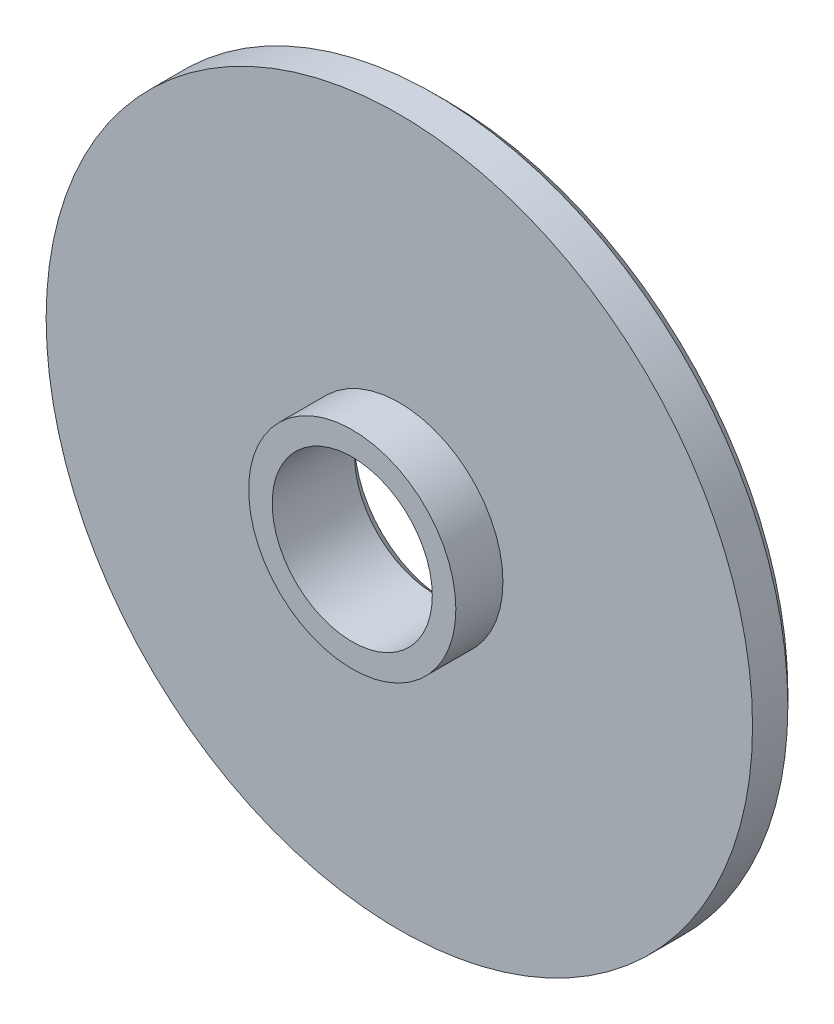
ISO-10303-21;
HEADER;
FILE_DESCRIPTION(('STEP AP214'),'2;1');
FILE_NAME('part.step','',(''),(''),'','','');
FILE_SCHEMA(('AUTOMOTIVE_DESIGN { 1 0 10303 214 1 1 1 1 }'));
ENDSEC;
DATA;
#1=APPLICATION_CONTEXT('core data for automotive mechanical design processes');
#2=APPLICATION_PROTOCOL_DEFINITION('international standard','automotive_design',2000,#1);
#3=PRODUCT_CONTEXT('',#1,'mechanical');
#4=PRODUCT('Part','Part','',(#3));
#5=PRODUCT_RELATED_PRODUCT_CATEGORY('part','',(#4));
#6=PRODUCT_DEFINITION_FORMATION('','',#4);
#7=PRODUCT_DEFINITION_CONTEXT('part definition',#1,'design');
#8=PRODUCT_DEFINITION('design','',#6,#7);
#9=PRODUCT_DEFINITION_SHAPE('','',#8);
#10=(LENGTH_UNIT() NAMED_UNIT(*) SI_UNIT(.MILLI.,.METRE.));
#11=(NAMED_UNIT(*) PLANE_ANGLE_UNIT() SI_UNIT($,.RADIAN.));
#12=(NAMED_UNIT(*) SI_UNIT($,.STERADIAN.) SOLID_ANGLE_UNIT());
#13=UNCERTAINTY_MEASURE_WITH_UNIT(LENGTH_MEASURE(1.E-05),#10,'distance_accuracy_value','');
#14=(GEOMETRIC_REPRESENTATION_CONTEXT(3) GLOBAL_UNCERTAINTY_ASSIGNED_CONTEXT((#13)) GLOBAL_UNIT_ASSIGNED_CONTEXT((#10,
#11,#12)) REPRESENTATION_CONTEXT('',''));
#15=CARTESIAN_POINT('',(0.,0.,0.));
#16=DIRECTION('',(0.,0.,1.));
#17=DIRECTION('',(1.,0.,0.));
#18=AXIS2_PLACEMENT_3D('',#15,#16,#17);
#19=CARTESIAN_POINT('',(0.,0.,1.));
#20=DIRECTION('',(0.,0.,1.));
#21=DIRECTION('',(1.,0.,0.));
#22=AXIS2_PLACEMENT_3D('',#19,#20,#21);
#23=PLANE('',#22);
#24=CARTESIAN_POINT('',(0.,0.,1.));
#25=DIRECTION('',(0.,0.,1.));
#26=DIRECTION('',(1.,0.,0.));
#27=AXIS2_PLACEMENT_3D('',#24,#25,#26);
#28=CIRCLE('',#27,7.5);
#29=CARTESIAN_POINT('',(7.5,0.,1.));
#30=VERTEX_POINT('',#29);
#31=EDGE_CURVE('E64',#30,#30,#28,.T.);
#32=ORIENTED_EDGE('',*,*,#31,.T.);
#33=EDGE_LOOP('',(#32));
#34=FACE_BOUND('',#33,.T.);
#35=CARTESIAN_POINT('',(0.,0.,1.));
#36=DIRECTION('',(0.,0.,1.));
#37=DIRECTION('',(1.,0.,0.));
#38=AXIS2_PLACEMENT_3D('',#35,#36,#37);
#39=CIRCLE('',#38,2.2);
#40=CARTESIAN_POINT('',(2.2,0.,1.));
#41=VERTEX_POINT('',#40);
#42=EDGE_CURVE('E69',#41,#41,#39,.T.);
#43=ORIENTED_EDGE('',*,*,#42,.F.);
#44=EDGE_LOOP('',(#43));
#45=FACE_BOUND('',#44,.T.);
#46=ADVANCED_FACE('F39',(#34,#45),#23,.T.);
#47=CARTESIAN_POINT('',(0.,0.,0.));
#48=DIRECTION('',(0.,0.,1.));
#49=DIRECTION('',(1.,0.,0.));
#50=AXIS2_PLACEMENT_3D('',#47,#48,#49);
#51=PLANE('',#50);
#52=CARTESIAN_POINT('',(0.,0.,0.));
#53=DIRECTION('',(0.,0.,1.));
#54=DIRECTION('',(1.,0.,0.));
#55=AXIS2_PLACEMENT_3D('',#52,#53,#54);
#56=CIRCLE('',#55,1.95);
#57=CARTESIAN_POINT('',(1.95,0.,0.));
#58=VERTEX_POINT('',#57);
#59=EDGE_CURVE('E53',#58,#58,#56,.T.);
#60=ORIENTED_EDGE('',*,*,#59,.T.);
#61=EDGE_LOOP('',(#60));
#62=FACE_BOUND('',#61,.T.);
#63=CARTESIAN_POINT('',(0.,0.,0.));
#64=DIRECTION('',(0.,0.,1.));
#65=DIRECTION('',(1.,0.,0.));
#66=AXIS2_PLACEMENT_3D('',#63,#64,#65);
#67=CIRCLE('',#66,7.25);
#68=CARTESIAN_POINT('',(7.25,0.,0.));
#69=VERTEX_POINT('',#68);
#70=EDGE_CURVE('E58',#69,#69,#67,.F.);
#71=ORIENTED_EDGE('',*,*,#70,.T.);
#72=EDGE_LOOP('',(#71));
#73=FACE_BOUND('',#72,.T.);
#74=ADVANCED_FACE('F98',(#62,#73),#51,.F.);
#75=CARTESIAN_POINT('',(0.,0.,1.));
#76=DIRECTION('',(0.,0.,-1.));
#77=DIRECTION('',(-1.,0.,0.));
#78=AXIS2_PLACEMENT_3D('',#75,#76,#77);
#79=CYLINDRICAL_SURFACE('',#78,7.5);
#80=CARTESIAN_POINT('',(0.,0.,0.250000000000001));
#81=DIRECTION('',(0.,0.,1.));
#82=DIRECTION('',(1.,0.,0.));
#83=AXIS2_PLACEMENT_3D('',#80,#81,#82);
#84=CIRCLE('',#83,7.5);
#85=CARTESIAN_POINT('',(7.5,0.,0.250000000000001));
#86=VERTEX_POINT('',#85);
#87=EDGE_CURVE('E10',#86,#86,#84,.T.);
#88=ORIENTED_EDGE('',*,*,#87,.T.);
#89=EDGE_LOOP('',(#88));
#90=FACE_BOUND('',#89,.T.);
#91=ORIENTED_EDGE('',*,*,#31,.F.);
#92=EDGE_LOOP('',(#91));
#93=FACE_BOUND('',#92,.T.);
#94=ADVANCED_FACE('F95',(#90,#93),#79,.T.);
#95=CARTESIAN_POINT('',(0.,0.,1.));
#96=DIRECTION('',(0.,0.,-1.));
#97=DIRECTION('',(-1.,0.,0.));
#98=AXIS2_PLACEMENT_3D('',#95,#96,#97);
#99=CYLINDRICAL_SURFACE('',#98,1.7);
#100=CARTESIAN_POINT('',(0.,0.,0.250000000000001));
#101=DIRECTION('',(0.,0.,1.));
#102=DIRECTION('',(1.,0.,0.));
#103=AXIS2_PLACEMENT_3D('',#100,#101,#102);
#104=CIRCLE('',#103,1.7);
#105=CARTESIAN_POINT('',(1.7,0.,0.250000000000001));
#106=VERTEX_POINT('',#105);
#107=EDGE_CURVE('E48',#106,#106,#104,.F.);
#108=ORIENTED_EDGE('',*,*,#107,.T.);
#109=EDGE_LOOP('',(#108));
#110=FACE_BOUND('',#109,.T.);
#111=CARTESIAN_POINT('',(0.,0.,2.));
#112=DIRECTION('',(0.,0.,1.));
#113=DIRECTION('',(1.,0.,0.));
#114=AXIS2_PLACEMENT_3D('',#111,#112,#113);
#115=CIRCLE('',#114,1.7);
#116=CARTESIAN_POINT('',(1.7,0.,2.));
#117=VERTEX_POINT('',#116);
#118=EDGE_CURVE('E73',#117,#117,#115,.T.);
#119=ORIENTED_EDGE('',*,*,#118,.T.);
#120=EDGE_LOOP('',(#119));
#121=FACE_BOUND('',#120,.T.);
#122=ADVANCED_FACE('F81',(#110,#121),#99,.F.);
#123=CARTESIAN_POINT('',(0.,0.,2.));
#124=DIRECTION('',(0.,0.,1.));
#125=DIRECTION('',(1.,0.,0.));
#126=AXIS2_PLACEMENT_3D('',#123,#124,#125);
#127=PLANE('',#126);
#128=CARTESIAN_POINT('',(0.,0.,2.));
#129=DIRECTION('',(0.,0.,1.));
#130=DIRECTION('',(1.,0.,0.));
#131=AXIS2_PLACEMENT_3D('',#128,#129,#130);
#132=CIRCLE('',#131,2.2);
#133=CARTESIAN_POINT('',(2.2,0.,2.));
#134=VERTEX_POINT('',#133);
#135=EDGE_CURVE('E68',#134,#134,#132,.T.);
#136=ORIENTED_EDGE('',*,*,#135,.T.);
#137=EDGE_LOOP('',(#136));
#138=FACE_BOUND('',#137,.T.);
#139=ORIENTED_EDGE('',*,*,#118,.F.);
#140=EDGE_LOOP('',(#139));
#141=FACE_BOUND('',#140,.T.);
#142=ADVANCED_FACE('F83',(#138,#141),#127,.T.);
#143=CARTESIAN_POINT('',(0.,0.,2.));
#144=DIRECTION('',(0.,0.,-1.));
#145=DIRECTION('',(-1.,0.,0.));
#146=AXIS2_PLACEMENT_3D('',#143,#144,#145);
#147=CYLINDRICAL_SURFACE('',#146,2.2);
#148=ORIENTED_EDGE('',*,*,#135,.F.);
#149=EDGE_LOOP('',(#148));
#150=FACE_BOUND('',#149,.T.);
#151=ORIENTED_EDGE('',*,*,#42,.T.);
#152=EDGE_LOOP('',(#151));
#153=FACE_BOUND('',#152,.T.);
#154=ADVANCED_FACE('F85',(#150,#153),#147,.T.);
#155=CARTESIAN_POINT('',(0.,0.,0.));
#156=DIRECTION('',(0.,0.,-1.));
#157=DIRECTION('',(-1.,0.,0.));
#158=AXIS2_PLACEMENT_3D('',#155,#156,#157);
#159=CONICAL_SURFACE('',#158,1.95,0.785398163397446);
#160=ORIENTED_EDGE('',*,*,#107,.F.);
#161=EDGE_LOOP('',(#160));
#162=FACE_BOUND('',#161,.T.);
#163=ORIENTED_EDGE('',*,*,#59,.F.);
#164=EDGE_LOOP('',(#163));
#165=FACE_BOUND('',#164,.T.);
#166=ADVANCED_FACE('F92',(#162,#165),#159,.F.);
#167=CARTESIAN_POINT('',(0.,0.,0.250000000000001));
#168=DIRECTION('',(0.,0.,1.));
#169=DIRECTION('',(1.,0.,0.));
#170=AXIS2_PLACEMENT_3D('',#167,#168,#169);
#171=CONICAL_SURFACE('',#170,7.5,0.785398163397452);
#172=ORIENTED_EDGE('',*,*,#70,.F.);
#173=EDGE_LOOP('',(#172));
#174=FACE_BOUND('',#173,.T.);
#175=ORIENTED_EDGE('',*,*,#87,.F.);
#176=EDGE_LOOP('',(#175));
#177=FACE_BOUND('',#176,.T.);
#178=ADVANCED_FACE('F42',(#174,#177),#171,.T.);
#179=CLOSED_SHELL('',(#46,#74,#94,#122,#142,#154,#166,#178));
#180=MANIFOLD_SOLID_BREP('B2',#179);
#181=ADVANCED_BREP_SHAPE_REPRESENTATION('',(#18,#180),#14);
#182=SHAPE_DEFINITION_REPRESENTATION(#9,#181);
ENDSEC;
END-ISO-10303-21;
